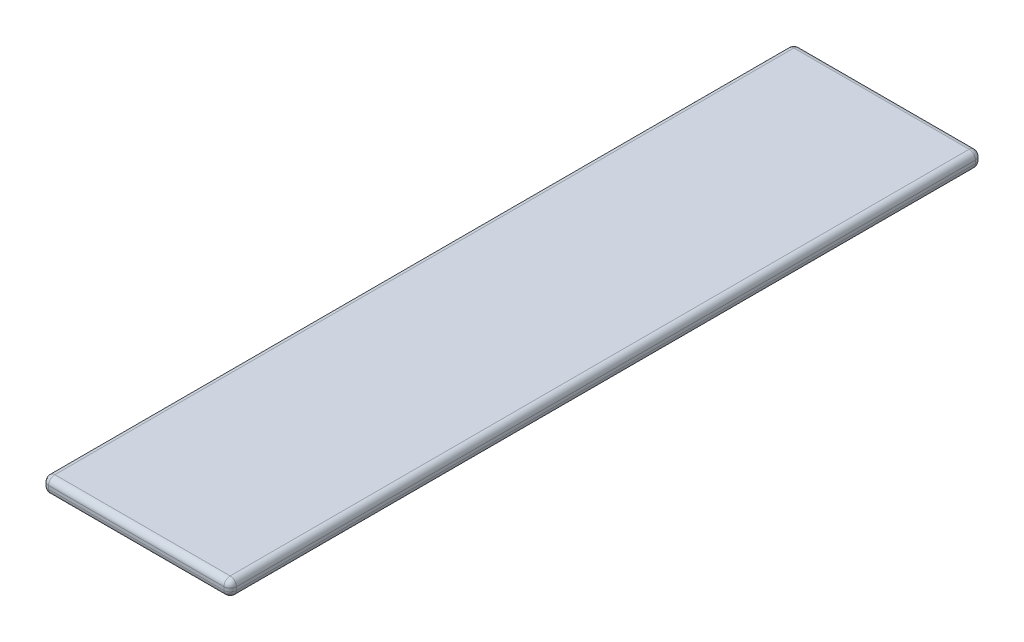
ISO-10303-21;
HEADER;
FILE_DESCRIPTION(('STEP AP214'),'2;1');
FILE_NAME('part.step','',(''),(''),'','','');
FILE_SCHEMA(('AUTOMOTIVE_DESIGN { 1 0 10303 214 1 1 1 1 }'));
ENDSEC;
DATA;
#1=APPLICATION_CONTEXT('core data for automotive mechanical design processes');
#2=APPLICATION_PROTOCOL_DEFINITION('international standard','automotive_design',2000,#1);
#3=PRODUCT_CONTEXT('',#1,'mechanical');
#4=PRODUCT('Part','Part','',(#3));
#5=PRODUCT_RELATED_PRODUCT_CATEGORY('part','',(#4));
#6=PRODUCT_DEFINITION_FORMATION('','',#4);
#7=PRODUCT_DEFINITION_CONTEXT('part definition',#1,'design');
#8=PRODUCT_DEFINITION('design','',#6,#7);
#9=PRODUCT_DEFINITION_SHAPE('','',#8);
#10=(LENGTH_UNIT() NAMED_UNIT(*) SI_UNIT(.MILLI.,.METRE.));
#11=(NAMED_UNIT(*) PLANE_ANGLE_UNIT() SI_UNIT($,.RADIAN.));
#12=(NAMED_UNIT(*) SI_UNIT($,.STERADIAN.) SOLID_ANGLE_UNIT());
#13=UNCERTAINTY_MEASURE_WITH_UNIT(LENGTH_MEASURE(1.E-05),#10,'distance_accuracy_value','');
#14=(GEOMETRIC_REPRESENTATION_CONTEXT(3) GLOBAL_UNCERTAINTY_ASSIGNED_CONTEXT((#13)) GLOBAL_UNIT_ASSIGNED_CONTEXT((#10,
#11,#12)) REPRESENTATION_CONTEXT('',''));
#15=CARTESIAN_POINT('',(0.,0.,0.));
#16=DIRECTION('',(0.,0.,1.));
#17=DIRECTION('',(1.,0.,0.));
#18=AXIS2_PLACEMENT_3D('',#15,#16,#17);
#19=CARTESIAN_POINT('',(0.,6.35,304.8));
#20=DIRECTION('',(0.,-1.,0.));
#21=DIRECTION('',(1.,0.,0.));
#22=AXIS2_PLACEMENT_3D('',#19,#20,#21);
#23=PLANE('',#22);
#24=DIRECTION('',(0.,0.,1.));
#25=VECTOR('',#24,1.);
#26=CARTESIAN_POINT('',(-73.66,6.34999999999999,304.8));
#27=LINE('',#26,#25);
#28=CARTESIAN_POINT('',(-73.66,6.34999999999999,2.53999999999999));
#29=VERTEX_POINT('',#28);
#30=CARTESIAN_POINT('',(-73.66,6.34999999999999,302.26));
#31=VERTEX_POINT('',#30);
#32=EDGE_CURVE('E223',#29,#31,#27,.T.);
#33=ORIENTED_EDGE('',*,*,#32,.T.);
#34=DIRECTION('',(-1.,0.,0.));
#35=VECTOR('',#34,1.);
#36=CARTESIAN_POINT('',(0.,6.35,302.26));
#37=LINE('',#36,#35);
#38=CARTESIAN_POINT('',(-2.54,6.35,302.26));
#39=VERTEX_POINT('',#38);
#40=EDGE_CURVE('E225',#31,#39,#37,.F.);
#41=ORIENTED_EDGE('',*,*,#40,.T.);
#42=DIRECTION('',(0.,0.,-1.));
#43=VECTOR('',#42,1.);
#44=CARTESIAN_POINT('',(-2.54,6.35,304.8));
#45=LINE('',#44,#43);
#46=CARTESIAN_POINT('',(-2.54,6.35,2.53999999999999));
#47=VERTEX_POINT('',#46);
#48=EDGE_CURVE('E219',#39,#47,#45,.T.);
#49=ORIENTED_EDGE('',*,*,#48,.T.);
#50=DIRECTION('',(-1.,0.,0.));
#51=VECTOR('',#50,1.);
#52=CARTESIAN_POINT('',(0.,6.35,2.53999999999999));
#53=LINE('',#52,#51);
#54=EDGE_CURVE('E221',#47,#29,#53,.T.);
#55=ORIENTED_EDGE('',*,*,#54,.T.);
#56=EDGE_LOOP('',(#33,#41,#49,#55));
#57=FACE_BOUND('',#56,.T.);
#58=ADVANCED_FACE('F78',(#57),#23,.F.);
#59=CARTESIAN_POINT('',(0.,0.,304.8));
#60=DIRECTION('',(0.,-1.,0.));
#61=DIRECTION('',(1.,0.,0.));
#62=AXIS2_PLACEMENT_3D('',#59,#60,#61);
#63=PLANE('',#62);
#64=DIRECTION('',(0.,0.,-1.));
#65=VECTOR('',#64,1.);
#66=CARTESIAN_POINT('',(-2.54,0.,304.8));
#67=LINE('',#66,#65);
#68=CARTESIAN_POINT('',(-2.54,0.,2.54));
#69=VERTEX_POINT('',#68);
#70=CARTESIAN_POINT('',(-2.54,0.,302.26));
#71=VERTEX_POINT('',#70);
#72=EDGE_CURVE('E171',#69,#71,#67,.F.);
#73=ORIENTED_EDGE('',*,*,#72,.T.);
#74=DIRECTION('',(-1.,0.,0.));
#75=VECTOR('',#74,1.);
#76=CARTESIAN_POINT('',(0.,0.,302.26));
#77=LINE('',#76,#75);
#78=CARTESIAN_POINT('',(-73.66,0.,302.26));
#79=VERTEX_POINT('',#78);
#80=EDGE_CURVE('E208',#71,#79,#77,.T.);
#81=ORIENTED_EDGE('',*,*,#80,.T.);
#82=DIRECTION('',(0.,0.,1.));
#83=VECTOR('',#82,1.);
#84=CARTESIAN_POINT('',(-73.66,0.,304.8));
#85=LINE('',#84,#83);
#86=CARTESIAN_POINT('',(-73.66,0.,2.54));
#87=VERTEX_POINT('',#86);
#88=EDGE_CURVE('E174',#79,#87,#85,.F.);
#89=ORIENTED_EDGE('',*,*,#88,.T.);
#90=DIRECTION('',(-1.,0.,0.));
#91=VECTOR('',#90,1.);
#92=CARTESIAN_POINT('',(0.,0.,2.54));
#93=LINE('',#92,#91);
#94=EDGE_CURVE('E166',#87,#69,#93,.F.);
#95=ORIENTED_EDGE('',*,*,#94,.T.);
#96=EDGE_LOOP('',(#73,#81,#89,#95));
#97=FACE_BOUND('',#96,.T.);
#98=ADVANCED_FACE('F168',(#97),#63,.T.);
#99=CARTESIAN_POINT('',(0.,0.,304.8));
#100=DIRECTION('',(0.,0.,1.));
#101=DIRECTION('',(1.,0.,0.));
#102=AXIS2_PLACEMENT_3D('',#99,#100,#101);
#103=PLANE('',#102);
#104=DIRECTION('',(-1.,0.,0.));
#105=VECTOR('',#104,1.);
#106=CARTESIAN_POINT('',(-76.1999999999999,3.80999999999999,304.8));
#107=LINE('',#106,#105);
#108=CARTESIAN_POINT('',(-2.54,3.81,304.8));
#109=VERTEX_POINT('',#108);
#110=CARTESIAN_POINT('',(-73.66,3.80999999999999,304.8));
#111=VERTEX_POINT('',#110);
#112=EDGE_CURVE('E212',#109,#111,#107,.T.);
#113=ORIENTED_EDGE('',*,*,#112,.T.);
#114=DIRECTION('',(0.,-1.,0.));
#115=VECTOR('',#114,1.);
#116=CARTESIAN_POINT('',(-73.66,0.,304.8));
#117=LINE('',#116,#115);
#118=CARTESIAN_POINT('',(-73.66,2.53999999999999,304.8));
#119=VERTEX_POINT('',#118);
#120=EDGE_CURVE('E217',#111,#119,#117,.T.);
#121=ORIENTED_EDGE('',*,*,#120,.T.);
#122=DIRECTION('',(-1.,0.,0.));
#123=VECTOR('',#122,1.);
#124=CARTESIAN_POINT('',(0.,2.54,304.8));
#125=LINE('',#124,#123);
#126=CARTESIAN_POINT('',(-2.54,2.54,304.8));
#127=VERTEX_POINT('',#126);
#128=EDGE_CURVE('E214',#119,#127,#125,.F.);
#129=ORIENTED_EDGE('',*,*,#128,.T.);
#130=DIRECTION('',(0.,1.,0.));
#131=VECTOR('',#130,1.);
#132=CARTESIAN_POINT('',(-2.54,6.35,304.8));
#133=LINE('',#132,#131);
#134=EDGE_CURVE('E210',#127,#109,#133,.T.);
#135=ORIENTED_EDGE('',*,*,#134,.T.);
#136=EDGE_LOOP('',(#113,#121,#129,#135));
#137=FACE_BOUND('',#136,.T.);
#138=ADVANCED_FACE('F343',(#137),#103,.T.);
#139=CARTESIAN_POINT('',(0.,0.,0.));
#140=DIRECTION('',(0.,0.,1.));
#141=DIRECTION('',(1.,0.,0.));
#142=AXIS2_PLACEMENT_3D('',#139,#140,#141);
#143=PLANE('',#142);
#144=DIRECTION('',(-1.,0.,0.));
#145=VECTOR('',#144,1.);
#146=CARTESIAN_POINT('',(-76.2,2.53999999999999,0.));
#147=LINE('',#146,#145);
#148=CARTESIAN_POINT('',(-2.54,2.54,0.));
#149=VERTEX_POINT('',#148);
#150=CARTESIAN_POINT('',(-73.66,2.53999999999999,0.));
#151=VERTEX_POINT('',#150);
#152=EDGE_CURVE('E185',#149,#151,#147,.T.);
#153=ORIENTED_EDGE('',*,*,#152,.T.);
#154=DIRECTION('',(0.,-1.,0.));
#155=VECTOR('',#154,1.);
#156=CARTESIAN_POINT('',(-73.66,6.34999999999999,0.));
#157=LINE('',#156,#155);
#158=CARTESIAN_POINT('',(-73.66,3.80999999999999,0.));
#159=VERTEX_POINT('',#158);
#160=EDGE_CURVE('E242',#151,#159,#157,.F.);
#161=ORIENTED_EDGE('',*,*,#160,.T.);
#162=DIRECTION('',(-1.,0.,0.));
#163=VECTOR('',#162,1.);
#164=CARTESIAN_POINT('',(0.,3.81,0.));
#165=LINE('',#164,#163);
#166=CARTESIAN_POINT('',(-2.54,3.81,0.));
#167=VERTEX_POINT('',#166);
#168=EDGE_CURVE('E239',#159,#167,#165,.F.);
#169=ORIENTED_EDGE('',*,*,#168,.T.);
#170=DIRECTION('',(0.,1.,0.));
#171=VECTOR('',#170,1.);
#172=CARTESIAN_POINT('',(-2.54,0.,0.));
#173=LINE('',#172,#171);
#174=EDGE_CURVE('E237',#167,#149,#173,.F.);
#175=ORIENTED_EDGE('',*,*,#174,.T.);
#176=EDGE_LOOP('',(#153,#161,#169,#175));
#177=FACE_BOUND('',#176,.T.);
#178=ADVANCED_FACE('F340',(#177),#143,.F.);
#179=CARTESIAN_POINT('',(0.,0.,304.8));
#180=DIRECTION('',(-1.,0.,0.));
#181=DIRECTION('',(0.,0.,1.));
#182=AXIS2_PLACEMENT_3D('',#179,#180,#181);
#183=PLANE('',#182);
#184=DIRECTION('',(0.,1.,0.));
#185=VECTOR('',#184,1.);
#186=CARTESIAN_POINT('',(0.,0.,302.26));
#187=LINE('',#186,#185);
#188=CARTESIAN_POINT('',(0.,3.81,302.26));
#189=VERTEX_POINT('',#188);
#190=CARTESIAN_POINT('',(0.,2.54,302.26));
#191=VERTEX_POINT('',#190);
#192=EDGE_CURVE('E87',#189,#191,#187,.F.);
#193=ORIENTED_EDGE('',*,*,#192,.T.);
#194=DIRECTION('',(0.,0.,-1.));
#195=VECTOR('',#194,1.);
#196=CARTESIAN_POINT('',(0.,2.54,0.));
#197=LINE('',#196,#195);
#198=CARTESIAN_POINT('',(0.,2.54,2.53999999999999));
#199=VERTEX_POINT('',#198);
#200=EDGE_CURVE('E12',#191,#199,#197,.T.);
#201=ORIENTED_EDGE('',*,*,#200,.T.);
#202=DIRECTION('',(0.,1.,0.));
#203=VECTOR('',#202,1.);
#204=CARTESIAN_POINT('',(0.,0.,2.53999999999999));
#205=LINE('',#204,#203);
#206=CARTESIAN_POINT('',(0.,3.81,2.53999999999999));
#207=VERTEX_POINT('',#206);
#208=EDGE_CURVE('E244',#199,#207,#205,.T.);
#209=ORIENTED_EDGE('',*,*,#208,.T.);
#210=DIRECTION('',(0.,0.,-1.));
#211=VECTOR('',#210,1.);
#212=CARTESIAN_POINT('',(0.,3.81,304.8));
#213=LINE('',#212,#211);
#214=EDGE_CURVE('E98',#207,#189,#213,.F.);
#215=ORIENTED_EDGE('',*,*,#214,.T.);
#216=EDGE_LOOP('',(#193,#201,#209,#215));
#217=FACE_BOUND('',#216,.T.);
#218=ADVANCED_FACE('F342',(#217),#183,.F.);
#219=CARTESIAN_POINT('',(-76.2,-1.75207071073658E-13,0.));
#220=DIRECTION('',(-1.,0.,0.));
#221=DIRECTION('',(0.,-1.,0.));
#222=AXIS2_PLACEMENT_3D('',#219,#220,#221);
#223=PLANE('',#222);
#224=DIRECTION('',(0.,0.,1.));
#225=VECTOR('',#224,1.);
#226=CARTESIAN_POINT('',(-76.2,2.53999999999999,0.));
#227=LINE('',#226,#225);
#228=CARTESIAN_POINT('',(-76.2,2.53999999999999,2.54));
#229=VERTEX_POINT('',#228);
#230=CARTESIAN_POINT('',(-76.1999999999999,2.53999999999999,302.26));
#231=VERTEX_POINT('',#230);
#232=EDGE_CURVE('E232',#229,#231,#227,.T.);
#233=ORIENTED_EDGE('',*,*,#232,.T.);
#234=DIRECTION('',(0.,-1.,0.));
#235=VECTOR('',#234,1.);
#236=CARTESIAN_POINT('',(-76.1999999999999,-1.75207071073658E-13,302.26));
#237=LINE('',#236,#235);
#238=CARTESIAN_POINT('',(-76.1999999999999,3.80999999999999,302.26));
#239=VERTEX_POINT('',#238);
#240=EDGE_CURVE('E234',#231,#239,#237,.F.);
#241=ORIENTED_EDGE('',*,*,#240,.T.);
#242=DIRECTION('',(0.,0.,1.));
#243=VECTOR('',#242,1.);
#244=CARTESIAN_POINT('',(-76.2,3.80999999999999,0.));
#245=LINE('',#244,#243);
#246=CARTESIAN_POINT('',(-76.2,3.80999999999999,2.54));
#247=VERTEX_POINT('',#246);
#248=EDGE_CURVE('E230',#239,#247,#245,.F.);
#249=ORIENTED_EDGE('',*,*,#248,.T.);
#250=DIRECTION('',(0.,-1.,0.));
#251=VECTOR('',#250,1.);
#252=CARTESIAN_POINT('',(-76.2,-1.75207071073658E-13,2.54));
#253=LINE('',#252,#251);
#254=EDGE_CURVE('E228',#247,#229,#253,.T.);
#255=ORIENTED_EDGE('',*,*,#254,.T.);
#256=EDGE_LOOP('',(#233,#241,#249,#255));
#257=FACE_BOUND('',#256,.T.);
#258=ADVANCED_FACE('F311',(#257),#223,.T.);
#259=CARTESIAN_POINT('',(0.,3.81,2.53999999999999));
#260=DIRECTION('',(-1.,0.,0.));
#261=DIRECTION('',(0.,-1.,0.));
#262=AXIS2_PLACEMENT_3D('',#259,#260,#261);
#263=CYLINDRICAL_SURFACE('',#262,2.54);
#264=CARTESIAN_POINT('',(-2.54,3.81,2.54));
#265=DIRECTION('',(1.,0.,0.));
#266=DIRECTION('',(0.,0.,-1.));
#267=AXIS2_PLACEMENT_3D('',#264,#265,#266);
#268=CIRCLE('',#267,2.54);
#269=EDGE_CURVE('E82',#167,#47,#268,.T.);
#270=ORIENTED_EDGE('',*,*,#269,.F.);
#271=ORIENTED_EDGE('',*,*,#168,.F.);
#272=CARTESIAN_POINT('',(-73.66,3.80999999999999,2.53999999999999));
#273=DIRECTION('',(-1.,0.,0.));
#274=DIRECTION('',(0.,0.,1.));
#275=AXIS2_PLACEMENT_3D('',#272,#273,#274);
#276=CIRCLE('',#275,2.54);
#277=EDGE_CURVE('E205',#29,#159,#276,.T.);
#278=ORIENTED_EDGE('',*,*,#277,.F.);
#279=ORIENTED_EDGE('',*,*,#54,.F.);
#280=EDGE_LOOP('',(#270,#271,#278,#279));
#281=FACE_BOUND('',#280,.T.);
#282=ADVANCED_FACE('F80',(#281),#263,.T.);
#283=CARTESIAN_POINT('',(-2.54,3.81,2.54));
#284=DIRECTION('',(0.,0.,1.));
#285=DIRECTION('',(1.,0.,0.));
#286=AXIS2_PLACEMENT_3D('',#283,#284,#285);
#287=SPHERICAL_SURFACE('',#286,2.54);
#288=CARTESIAN_POINT('',(-2.54,3.81,2.53999999999999));
#289=DIRECTION('',(0.,1.,0.));
#290=DIRECTION('',(0.,0.,1.));
#291=AXIS2_PLACEMENT_3D('',#288,#289,#290);
#292=CIRCLE('',#291,2.54);
#293=EDGE_CURVE('E289',#167,#207,#292,.F.);
#294=ORIENTED_EDGE('',*,*,#293,.F.);
#295=ORIENTED_EDGE('',*,*,#269,.T.);
#296=CARTESIAN_POINT('',(-2.54,3.81,2.53999999999999));
#297=DIRECTION('',(0.,0.,-1.));
#298=DIRECTION('',(-1.,0.,0.));
#299=AXIS2_PLACEMENT_3D('',#296,#297,#298);
#300=CIRCLE('',#299,2.54);
#301=EDGE_CURVE('E292',#207,#47,#300,.F.);
#302=ORIENTED_EDGE('',*,*,#301,.F.);
#303=EDGE_LOOP('',(#294,#295,#302));
#304=FACE_BOUND('',#303,.T.);
#305=ADVANCED_FACE('F335',(#304),#287,.T.);
#306=CARTESIAN_POINT('',(-73.66,3.80999999999999,2.54));
#307=DIRECTION('',(0.,0.,1.));
#308=DIRECTION('',(1.,0.,0.));
#309=AXIS2_PLACEMENT_3D('',#306,#307,#308);
#310=SPHERICAL_SURFACE('',#309,2.54);
#311=CARTESIAN_POINT('',(-73.66,3.80999999999999,2.54));
#312=DIRECTION('',(0.,0.,-1.));
#313=DIRECTION('',(0.,1.,0.));
#314=AXIS2_PLACEMENT_3D('',#311,#312,#313);
#315=CIRCLE('',#314,2.54);
#316=EDGE_CURVE('E283',#29,#247,#315,.F.);
#317=ORIENTED_EDGE('',*,*,#316,.F.);
#318=ORIENTED_EDGE('',*,*,#277,.T.);
#319=CARTESIAN_POINT('',(-73.66,3.80999999999999,2.54));
#320=DIRECTION('',(0.,1.,0.));
#321=DIRECTION('',(-1.,0.,0.));
#322=AXIS2_PLACEMENT_3D('',#319,#320,#321);
#323=CIRCLE('',#322,2.54);
#324=EDGE_CURVE('E286',#247,#159,#323,.F.);
#325=ORIENTED_EDGE('',*,*,#324,.F.);
#326=EDGE_LOOP('',(#317,#318,#325));
#327=FACE_BOUND('',#326,.T.);
#328=ADVANCED_FACE('F299',(#327),#310,.T.);
#329=CARTESIAN_POINT('',(-2.54,3.81,304.8));
#330=DIRECTION('',(0.,0.,-1.));
#331=DIRECTION('',(-1.,0.,0.));
#332=AXIS2_PLACEMENT_3D('',#329,#330,#331);
#333=CYLINDRICAL_SURFACE('',#332,2.54);
#334=ORIENTED_EDGE('',*,*,#301,.T.);
#335=ORIENTED_EDGE('',*,*,#48,.F.);
#336=CARTESIAN_POINT('',(-2.54,3.81,302.26));
#337=DIRECTION('',(0.,0.,1.));
#338=DIRECTION('',(1.,0.,0.));
#339=AXIS2_PLACEMENT_3D('',#336,#337,#338);
#340=CIRCLE('',#339,2.54);
#341=EDGE_CURVE('E278',#189,#39,#340,.T.);
#342=ORIENTED_EDGE('',*,*,#341,.F.);
#343=ORIENTED_EDGE('',*,*,#214,.F.);
#344=EDGE_LOOP('',(#334,#335,#342,#343));
#345=FACE_BOUND('',#344,.T.);
#346=ADVANCED_FACE('F330',(#345),#333,.T.);
#347=CARTESIAN_POINT('',(-2.54,0.,2.53999999999999));
#348=DIRECTION('',(0.,1.,0.));
#349=DIRECTION('',(0.,0.,1.));
#350=AXIS2_PLACEMENT_3D('',#347,#348,#349);
#351=CYLINDRICAL_SURFACE('',#350,2.54);
#352=ORIENTED_EDGE('',*,*,#293,.T.);
#353=ORIENTED_EDGE('',*,*,#208,.F.);
#354=CARTESIAN_POINT('',(-2.54,2.54,2.54));
#355=DIRECTION('',(0.,-1.,0.));
#356=DIRECTION('',(1.,0.,0.));
#357=AXIS2_PLACEMENT_3D('',#354,#355,#356);
#358=CIRCLE('',#357,2.54);
#359=EDGE_CURVE('E189',#149,#199,#358,.T.);
#360=ORIENTED_EDGE('',*,*,#359,.F.);
#361=ORIENTED_EDGE('',*,*,#174,.F.);
#362=EDGE_LOOP('',(#352,#353,#360,#361));
#363=FACE_BOUND('',#362,.T.);
#364=ADVANCED_FACE('F338',(#363),#351,.T.);
#365=CARTESIAN_POINT('',(0.,2.54,2.54));
#366=DIRECTION('',(1.,0.,0.));
#367=DIRECTION('',(0.,1.,0.));
#368=AXIS2_PLACEMENT_3D('',#365,#366,#367);
#369=CYLINDRICAL_SURFACE('',#368,2.54);
#370=CARTESIAN_POINT('',(-73.66,2.53999999999999,2.54));
#371=DIRECTION('',(-1.,0.,0.));
#372=DIRECTION('',(0.,0.,1.));
#373=AXIS2_PLACEMENT_3D('',#370,#371,#372);
#374=CIRCLE('',#373,2.54);
#375=EDGE_CURVE('E190',#151,#87,#374,.T.);
#376=ORIENTED_EDGE('',*,*,#375,.F.);
#377=ORIENTED_EDGE('',*,*,#152,.F.);
#378=CARTESIAN_POINT('',(-2.54,2.54,2.54));
#379=DIRECTION('',(1.,0.,0.));
#380=DIRECTION('',(0.,1.,0.));
#381=AXIS2_PLACEMENT_3D('',#378,#379,#380);
#382=CIRCLE('',#381,2.54);
#383=EDGE_CURVE('E181',#69,#149,#382,.T.);
#384=ORIENTED_EDGE('',*,*,#383,.F.);
#385=ORIENTED_EDGE('',*,*,#94,.F.);
#386=EDGE_LOOP('',(#376,#377,#384,#385));
#387=FACE_BOUND('',#386,.T.);
#388=ADVANCED_FACE('F183',(#387),#369,.T.);
#389=CARTESIAN_POINT('',(-73.66,-1.74903494465362E-13,2.54));
#390=DIRECTION('',(0.,1.,0.));
#391=DIRECTION('',(-1.,0.,0.));
#392=AXIS2_PLACEMENT_3D('',#389,#390,#391);
#393=CYLINDRICAL_SURFACE('',#392,2.54);
#394=ORIENTED_EDGE('',*,*,#324,.T.);
#395=ORIENTED_EDGE('',*,*,#160,.F.);
#396=CARTESIAN_POINT('',(-73.66,2.53999999999999,2.54));
#397=DIRECTION('',(0.,-1.,0.));
#398=DIRECTION('',(1.,0.,0.));
#399=AXIS2_PLACEMENT_3D('',#396,#397,#398);
#400=CIRCLE('',#399,2.54);
#401=EDGE_CURVE('E274',#229,#151,#400,.T.);
#402=ORIENTED_EDGE('',*,*,#401,.F.);
#403=ORIENTED_EDGE('',*,*,#254,.F.);
#404=EDGE_LOOP('',(#394,#395,#402,#403));
#405=FACE_BOUND('',#404,.T.);
#406=ADVANCED_FACE('F307',(#405),#393,.T.);
#407=CARTESIAN_POINT('',(-73.66,3.80999999999999,304.8));
#408=DIRECTION('',(0.,0.,-1.));
#409=DIRECTION('',(-1.,0.,0.));
#410=AXIS2_PLACEMENT_3D('',#407,#408,#409);
#411=CYLINDRICAL_SURFACE('',#410,2.54);
#412=ORIENTED_EDGE('',*,*,#316,.T.);
#413=ORIENTED_EDGE('',*,*,#248,.F.);
#414=CARTESIAN_POINT('',(-73.66,3.80999999999999,302.26));
#415=DIRECTION('',(0.,0.,1.));
#416=DIRECTION('',(1.,0.,0.));
#417=AXIS2_PLACEMENT_3D('',#414,#415,#416);
#418=CIRCLE('',#417,2.54);
#419=EDGE_CURVE('E271',#31,#239,#418,.T.);
#420=ORIENTED_EDGE('',*,*,#419,.F.);
#421=ORIENTED_EDGE('',*,*,#32,.F.);
#422=EDGE_LOOP('',(#412,#413,#420,#421));
#423=FACE_BOUND('',#422,.T.);
#424=ADVANCED_FACE('F317',(#423),#411,.T.);
#425=CARTESIAN_POINT('',(0.,3.81,302.26));
#426=DIRECTION('',(1.,0.,0.));
#427=DIRECTION('',(0.,1.,0.));
#428=AXIS2_PLACEMENT_3D('',#425,#426,#427);
#429=CYLINDRICAL_SURFACE('',#428,2.54);
#430=CARTESIAN_POINT('',(-2.54,3.81,302.26));
#431=DIRECTION('',(1.,0.,0.));
#432=DIRECTION('',(0.,0.,-1.));
#433=AXIS2_PLACEMENT_3D('',#430,#431,#432);
#434=CIRCLE('',#433,2.54);
#435=EDGE_CURVE('E280',#39,#109,#434,.T.);
#436=ORIENTED_EDGE('',*,*,#435,.F.);
#437=ORIENTED_EDGE('',*,*,#40,.F.);
#438=CARTESIAN_POINT('',(-73.66,3.80999999999999,302.26));
#439=DIRECTION('',(-1.,0.,0.));
#440=DIRECTION('',(0.,0.,1.));
#441=AXIS2_PLACEMENT_3D('',#438,#439,#440);
#442=CIRCLE('',#441,2.54);
#443=EDGE_CURVE('E268',#111,#31,#442,.T.);
#444=ORIENTED_EDGE('',*,*,#443,.F.);
#445=ORIENTED_EDGE('',*,*,#112,.F.);
#446=EDGE_LOOP('',(#436,#437,#444,#445));
#447=FACE_BOUND('',#446,.T.);
#448=ADVANCED_FACE('F323',(#447),#429,.T.);
#449=CARTESIAN_POINT('',(-2.54,3.81,302.26));
#450=DIRECTION('',(0.,0.,1.));
#451=DIRECTION('',(1.,0.,0.));
#452=AXIS2_PLACEMENT_3D('',#449,#450,#451);
#453=SPHERICAL_SURFACE('',#452,2.54);
#454=ORIENTED_EDGE('',*,*,#341,.T.);
#455=ORIENTED_EDGE('',*,*,#435,.T.);
#456=CARTESIAN_POINT('',(-2.54,3.81,302.26));
#457=DIRECTION('',(0.,1.,0.));
#458=DIRECTION('',(0.,0.,1.));
#459=AXIS2_PLACEMENT_3D('',#456,#457,#458);
#460=CIRCLE('',#459,2.54);
#461=EDGE_CURVE('E196',#189,#109,#460,.F.);
#462=ORIENTED_EDGE('',*,*,#461,.F.);
#463=EDGE_LOOP('',(#454,#455,#462));
#464=FACE_BOUND('',#463,.T.);
#465=ADVANCED_FACE('F395',(#464),#453,.T.);
#466=CARTESIAN_POINT('',(-2.54,2.54,2.54));
#467=DIRECTION('',(0.,0.,1.));
#468=DIRECTION('',(1.,0.,0.));
#469=AXIS2_PLACEMENT_3D('',#466,#467,#468);
#470=SPHERICAL_SURFACE('',#469,2.54);
#471=ORIENTED_EDGE('',*,*,#383,.T.);
#472=ORIENTED_EDGE('',*,*,#359,.T.);
#473=CARTESIAN_POINT('',(-2.54,2.54,2.53999999999999));
#474=DIRECTION('',(0.,0.,-1.));
#475=DIRECTION('',(0.,1.,0.));
#476=AXIS2_PLACEMENT_3D('',#473,#474,#475);
#477=CIRCLE('',#476,2.54);
#478=EDGE_CURVE('E192',#69,#199,#477,.F.);
#479=ORIENTED_EDGE('',*,*,#478,.F.);
#480=EDGE_LOOP('',(#471,#472,#479));
#481=FACE_BOUND('',#480,.T.);
#482=ADVANCED_FACE('F193',(#481),#470,.T.);
#483=CARTESIAN_POINT('',(-73.66,2.53999999999999,2.54));
#484=DIRECTION('',(0.,0.,1.));
#485=DIRECTION('',(1.,0.,0.));
#486=AXIS2_PLACEMENT_3D('',#483,#484,#485);
#487=SPHERICAL_SURFACE('',#486,2.54);
#488=ORIENTED_EDGE('',*,*,#401,.T.);
#489=ORIENTED_EDGE('',*,*,#375,.T.);
#490=CARTESIAN_POINT('',(-73.66,2.53999999999999,2.54));
#491=DIRECTION('',(0.,0.,-1.));
#492=DIRECTION('',(-1.,0.,0.));
#493=AXIS2_PLACEMENT_3D('',#490,#491,#492);
#494=CIRCLE('',#493,2.54);
#495=EDGE_CURVE('E197',#229,#87,#494,.F.);
#496=ORIENTED_EDGE('',*,*,#495,.F.);
#497=EDGE_LOOP('',(#488,#489,#496));
#498=FACE_BOUND('',#497,.T.);
#499=ADVANCED_FACE('F388',(#498),#487,.T.);
#500=CARTESIAN_POINT('',(-73.66,3.80999999999999,302.26));
#501=DIRECTION('',(0.,0.,1.));
#502=DIRECTION('',(1.,0.,0.));
#503=AXIS2_PLACEMENT_3D('',#500,#501,#502);
#504=SPHERICAL_SURFACE('',#503,2.54);
#505=ORIENTED_EDGE('',*,*,#443,.T.);
#506=ORIENTED_EDGE('',*,*,#419,.T.);
#507=CARTESIAN_POINT('',(-73.66,3.80999999999999,302.26));
#508=DIRECTION('',(0.,1.,0.));
#509=DIRECTION('',(-1.,0.,0.));
#510=AXIS2_PLACEMENT_3D('',#507,#508,#509);
#511=CIRCLE('',#510,2.54);
#512=EDGE_CURVE('E262',#111,#239,#511,.F.);
#513=ORIENTED_EDGE('',*,*,#512,.F.);
#514=EDGE_LOOP('',(#505,#506,#513));
#515=FACE_BOUND('',#514,.T.);
#516=ADVANCED_FACE('F384',(#515),#504,.T.);
#517=CARTESIAN_POINT('',(-2.54,0.,302.26));
#518=DIRECTION('',(0.,-1.,0.));
#519=DIRECTION('',(0.,0.,-1.));
#520=AXIS2_PLACEMENT_3D('',#517,#518,#519);
#521=CYLINDRICAL_SURFACE('',#520,2.54);
#522=ORIENTED_EDGE('',*,*,#461,.T.);
#523=ORIENTED_EDGE('',*,*,#134,.F.);
#524=CARTESIAN_POINT('',(-2.54,2.54,302.26));
#525=DIRECTION('',(0.,-1.,0.));
#526=DIRECTION('',(0.,0.,-1.));
#527=AXIS2_PLACEMENT_3D('',#524,#525,#526);
#528=CIRCLE('',#527,2.54);
#529=EDGE_CURVE('E259',#191,#127,#528,.T.);
#530=ORIENTED_EDGE('',*,*,#529,.F.);
#531=ORIENTED_EDGE('',*,*,#192,.F.);
#532=EDGE_LOOP('',(#522,#523,#530,#531));
#533=FACE_BOUND('',#532,.T.);
#534=ADVANCED_FACE('F381',(#533),#521,.T.);
#535=CARTESIAN_POINT('',(-2.54,2.54,304.8));
#536=DIRECTION('',(0.,0.,1.));
#537=DIRECTION('',(1.,0.,0.));
#538=AXIS2_PLACEMENT_3D('',#535,#536,#537);
#539=CYLINDRICAL_SURFACE('',#538,2.54);
#540=ORIENTED_EDGE('',*,*,#478,.T.);
#541=ORIENTED_EDGE('',*,*,#200,.F.);
#542=CARTESIAN_POINT('',(-2.54,2.54,302.26));
#543=DIRECTION('',(0.,0.,1.));
#544=DIRECTION('',(1.,0.,0.));
#545=AXIS2_PLACEMENT_3D('',#542,#543,#544);
#546=CIRCLE('',#545,2.54);
#547=EDGE_CURVE('E201',#71,#191,#546,.T.);
#548=ORIENTED_EDGE('',*,*,#547,.F.);
#549=ORIENTED_EDGE('',*,*,#72,.F.);
#550=EDGE_LOOP('',(#540,#541,#548,#549));
#551=FACE_BOUND('',#550,.T.);
#552=ADVANCED_FACE('F199',(#551),#539,.T.);
#553=CARTESIAN_POINT('',(-73.66,2.53999999999999,0.));
#554=DIRECTION('',(0.,0.,1.));
#555=DIRECTION('',(1.,0.,0.));
#556=AXIS2_PLACEMENT_3D('',#553,#554,#555);
#557=CYLINDRICAL_SURFACE('',#556,2.54);
#558=ORIENTED_EDGE('',*,*,#495,.T.);
#559=ORIENTED_EDGE('',*,*,#88,.F.);
#560=CARTESIAN_POINT('',(-73.66,2.53999999999999,302.26));
#561=DIRECTION('',(0.,0.,1.));
#562=DIRECTION('',(1.,0.,0.));
#563=AXIS2_PLACEMENT_3D('',#560,#561,#562);
#564=CIRCLE('',#563,2.54);
#565=EDGE_CURVE('E255',#231,#79,#564,.T.);
#566=ORIENTED_EDGE('',*,*,#565,.F.);
#567=ORIENTED_EDGE('',*,*,#232,.F.);
#568=EDGE_LOOP('',(#558,#559,#566,#567));
#569=FACE_BOUND('',#568,.T.);
#570=ADVANCED_FACE('F374',(#569),#557,.T.);
#571=CARTESIAN_POINT('',(-73.66,0.,302.26));
#572=DIRECTION('',(0.,-1.,0.));
#573=DIRECTION('',(1.,0.,0.));
#574=AXIS2_PLACEMENT_3D('',#571,#572,#573);
#575=CYLINDRICAL_SURFACE('',#574,2.54);
#576=ORIENTED_EDGE('',*,*,#512,.T.);
#577=ORIENTED_EDGE('',*,*,#240,.F.);
#578=CARTESIAN_POINT('',(-73.66,2.53999999999999,302.26));
#579=DIRECTION('',(0.,-1.,0.));
#580=DIRECTION('',(1.,0.,0.));
#581=AXIS2_PLACEMENT_3D('',#578,#579,#580);
#582=CIRCLE('',#581,2.54);
#583=EDGE_CURVE('E252',#119,#231,#582,.T.);
#584=ORIENTED_EDGE('',*,*,#583,.F.);
#585=ORIENTED_EDGE('',*,*,#120,.F.);
#586=EDGE_LOOP('',(#576,#577,#584,#585));
#587=FACE_BOUND('',#586,.T.);
#588=ADVANCED_FACE('F370',(#587),#575,.T.);
#589=CARTESIAN_POINT('',(-2.54,2.54,302.26));
#590=DIRECTION('',(0.,0.,1.));
#591=DIRECTION('',(1.,0.,0.));
#592=AXIS2_PLACEMENT_3D('',#589,#590,#591);
#593=SPHERICAL_SURFACE('',#592,2.54);
#594=ORIENTED_EDGE('',*,*,#547,.T.);
#595=ORIENTED_EDGE('',*,*,#529,.T.);
#596=CARTESIAN_POINT('',(-2.54,2.54,302.26));
#597=DIRECTION('',(1.,0.,0.));
#598=DIRECTION('',(0.,1.,0.));
#599=AXIS2_PLACEMENT_3D('',#596,#597,#598);
#600=CIRCLE('',#599,2.54);
#601=EDGE_CURVE('E250',#71,#127,#600,.F.);
#602=ORIENTED_EDGE('',*,*,#601,.F.);
#603=EDGE_LOOP('',(#594,#595,#602));
#604=FACE_BOUND('',#603,.T.);
#605=ADVANCED_FACE('F366',(#604),#593,.T.);
#606=CARTESIAN_POINT('',(-73.66,2.53999999999999,302.26));
#607=DIRECTION('',(0.,0.,1.));
#608=DIRECTION('',(1.,0.,0.));
#609=AXIS2_PLACEMENT_3D('',#606,#607,#608);
#610=SPHERICAL_SURFACE('',#609,2.54);
#611=ORIENTED_EDGE('',*,*,#583,.T.);
#612=ORIENTED_EDGE('',*,*,#565,.T.);
#613=CARTESIAN_POINT('',(-73.66,2.53999999999999,302.26));
#614=DIRECTION('',(-1.,0.,0.));
#615=DIRECTION('',(0.,0.,1.));
#616=AXIS2_PLACEMENT_3D('',#613,#614,#615);
#617=CIRCLE('',#616,2.54);
#618=EDGE_CURVE('E248',#119,#79,#617,.F.);
#619=ORIENTED_EDGE('',*,*,#618,.F.);
#620=EDGE_LOOP('',(#611,#612,#619));
#621=FACE_BOUND('',#620,.T.);
#622=ADVANCED_FACE('F362',(#621),#610,.T.);
#623=CARTESIAN_POINT('',(0.,2.54,302.26));
#624=DIRECTION('',(-1.,0.,0.));
#625=DIRECTION('',(0.,-1.,0.));
#626=AXIS2_PLACEMENT_3D('',#623,#624,#625);
#627=CYLINDRICAL_SURFACE('',#626,2.54);
#628=ORIENTED_EDGE('',*,*,#601,.T.);
#629=ORIENTED_EDGE('',*,*,#128,.F.);
#630=ORIENTED_EDGE('',*,*,#618,.T.);
#631=ORIENTED_EDGE('',*,*,#80,.F.);
#632=EDGE_LOOP('',(#628,#629,#630,#631));
#633=FACE_BOUND('',#632,.T.);
#634=ADVANCED_FACE('F359',(#633),#627,.T.);
#635=CLOSED_SHELL('',(#58,#98,#138,#178,#218,#258,#282,#305,#328,#346,#364,#388,#406,#424,#448,
#465,#482,#499,#516,#534,#552,#570,#588,#605,#622,#634));
#636=MANIFOLD_SOLID_BREP('B2',#635);
#637=ADVANCED_BREP_SHAPE_REPRESENTATION('',(#18,#636),#14);
#638=SHAPE_DEFINITION_REPRESENTATION(#9,#637);
ENDSEC;
END-ISO-10303-21;
